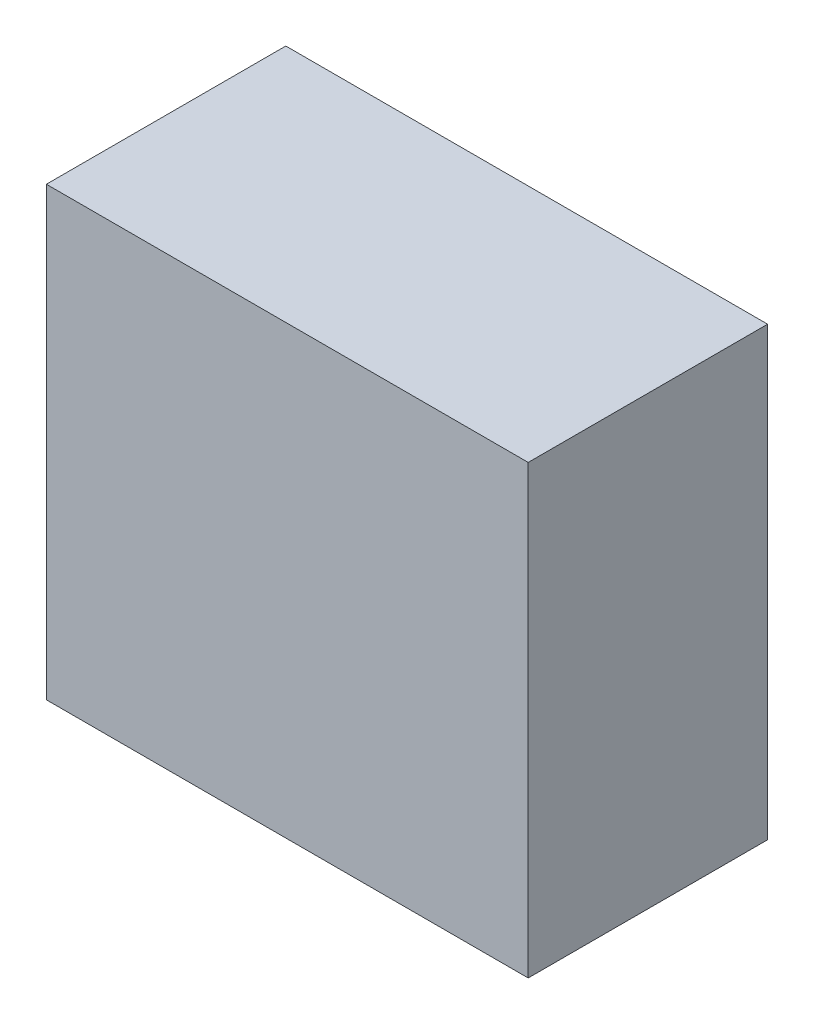
ISO-10303-21;
HEADER;
FILE_DESCRIPTION(('STEP AP214'),'2;1');
FILE_NAME('part.step','',(''),(''),'','','');
FILE_SCHEMA(('AUTOMOTIVE_DESIGN { 1 0 10303 214 1 1 1 1 }'));
ENDSEC;
DATA;
#1=APPLICATION_CONTEXT('core data for automotive mechanical design processes');
#2=APPLICATION_PROTOCOL_DEFINITION('international standard','automotive_design',2000,#1);
#3=PRODUCT_CONTEXT('',#1,'mechanical');
#4=PRODUCT('Part','Part','',(#3));
#5=PRODUCT_RELATED_PRODUCT_CATEGORY('part','',(#4));
#6=PRODUCT_DEFINITION_FORMATION('','',#4);
#7=PRODUCT_DEFINITION_CONTEXT('part definition',#1,'design');
#8=PRODUCT_DEFINITION('design','',#6,#7);
#9=PRODUCT_DEFINITION_SHAPE('','',#8);
#10=(LENGTH_UNIT() NAMED_UNIT(*) SI_UNIT(.MILLI.,.METRE.));
#11=(NAMED_UNIT(*) PLANE_ANGLE_UNIT() SI_UNIT($,.RADIAN.));
#12=(NAMED_UNIT(*) SI_UNIT($,.STERADIAN.) SOLID_ANGLE_UNIT());
#13=UNCERTAINTY_MEASURE_WITH_UNIT(LENGTH_MEASURE(1.E-05),#10,'distance_accuracy_value','');
#14=(GEOMETRIC_REPRESENTATION_CONTEXT(3) GLOBAL_UNCERTAINTY_ASSIGNED_CONTEXT((#13)) GLOBAL_UNIT_ASSIGNED_CONTEXT((#10,
#11,#12)) REPRESENTATION_CONTEXT('',''));
#15=CARTESIAN_POINT('',(0.,0.,0.));
#16=DIRECTION('',(0.,0.,1.));
#17=DIRECTION('',(1.,0.,0.));
#18=AXIS2_PLACEMENT_3D('',#15,#16,#17);
#19=CARTESIAN_POINT('',(20.125,37.3,-10.));
#20=DIRECTION('',(0.,1.,0.));
#21=DIRECTION('',(0.,0.,1.));
#22=AXIS2_PLACEMENT_3D('',#19,#20,#21);
#23=PLANE('',#22);
#24=DIRECTION('',(-1.,0.,0.));
#25=VECTOR('',#24,1.);
#26=CARTESIAN_POINT('',(20.125,37.3,10.));
#27=LINE('',#26,#25);
#28=CARTESIAN_POINT('',(20.125,37.3,10.));
#29=VERTEX_POINT('',#28);
#30=CARTESIAN_POINT('',(-20.125,37.3,10.));
#31=VERTEX_POINT('',#30);
#32=EDGE_CURVE('E103',#29,#31,#27,.T.);
#33=ORIENTED_EDGE('',*,*,#32,.F.);
#34=DIRECTION('',(0.,0.,1.));
#35=VECTOR('',#34,1.);
#36=CARTESIAN_POINT('',(20.125,37.3,-10.));
#37=LINE('',#36,#35);
#38=CARTESIAN_POINT('',(20.125,37.3,-10.));
#39=VERTEX_POINT('',#38);
#40=EDGE_CURVE('E11',#39,#29,#37,.T.);
#41=ORIENTED_EDGE('',*,*,#40,.F.);
#42=DIRECTION('',(-1.,0.,0.));
#43=VECTOR('',#42,1.);
#44=CARTESIAN_POINT('',(20.125,37.3,-10.));
#45=LINE('',#44,#43);
#46=CARTESIAN_POINT('',(-20.125,37.3,-10.));
#47=VERTEX_POINT('',#46);
#48=EDGE_CURVE('E97',#39,#47,#45,.T.);
#49=ORIENTED_EDGE('',*,*,#48,.T.);
#50=DIRECTION('',(0.,0.,1.));
#51=VECTOR('',#50,1.);
#52=CARTESIAN_POINT('',(-20.125,37.3,-10.));
#53=LINE('',#52,#51);
#54=EDGE_CURVE('E42',#47,#31,#53,.T.);
#55=ORIENTED_EDGE('',*,*,#54,.T.);
#56=EDGE_LOOP('',(#33,#41,#49,#55));
#57=FACE_BOUND('',#56,.T.);
#58=ADVANCED_FACE('F39',(#57),#23,.T.);
#59=CARTESIAN_POINT('',(20.125,0.,-10.));
#60=DIRECTION('',(1.,0.,0.));
#61=DIRECTION('',(0.,1.,0.));
#62=AXIS2_PLACEMENT_3D('',#59,#60,#61);
#63=PLANE('',#62);
#64=DIRECTION('',(0.,1.,0.));
#65=VECTOR('',#64,1.);
#66=CARTESIAN_POINT('',(20.125,0.,10.));
#67=LINE('',#66,#65);
#68=CARTESIAN_POINT('',(20.125,0.,10.));
#69=VERTEX_POINT('',#68);
#70=EDGE_CURVE('E99',#69,#29,#67,.T.);
#71=ORIENTED_EDGE('',*,*,#70,.F.);
#72=DIRECTION('',(0.,0.,1.));
#73=VECTOR('',#72,1.);
#74=CARTESIAN_POINT('',(20.125,0.,-10.));
#75=LINE('',#74,#73);
#76=CARTESIAN_POINT('',(20.125,0.,-10.));
#77=VERTEX_POINT('',#76);
#78=EDGE_CURVE('E48',#77,#69,#75,.T.);
#79=ORIENTED_EDGE('',*,*,#78,.F.);
#80=DIRECTION('',(0.,1.,0.));
#81=VECTOR('',#80,1.);
#82=CARTESIAN_POINT('',(20.125,0.,-10.));
#83=LINE('',#82,#81);
#84=EDGE_CURVE('E94',#77,#39,#83,.T.);
#85=ORIENTED_EDGE('',*,*,#84,.T.);
#86=ORIENTED_EDGE('',*,*,#40,.T.);
#87=EDGE_LOOP('',(#71,#79,#85,#86));
#88=FACE_BOUND('',#87,.T.);
#89=ADVANCED_FACE('F113',(#88),#63,.T.);
#90=CARTESIAN_POINT('',(-20.125,0.,-10.));
#91=DIRECTION('',(0.,-1.,0.));
#92=DIRECTION('',(0.,0.,-1.));
#93=AXIS2_PLACEMENT_3D('',#90,#91,#92);
#94=PLANE('',#93);
#95=DIRECTION('',(1.,0.,0.));
#96=VECTOR('',#95,1.);
#97=CARTESIAN_POINT('',(-20.125,0.,10.));
#98=LINE('',#97,#96);
#99=CARTESIAN_POINT('',(-20.125,0.,10.));
#100=VERTEX_POINT('',#99);
#101=EDGE_CURVE('E89',#100,#69,#98,.T.);
#102=ORIENTED_EDGE('',*,*,#101,.F.);
#103=DIRECTION('',(0.,0.,1.));
#104=VECTOR('',#103,1.);
#105=CARTESIAN_POINT('',(-20.125,0.,-10.));
#106=LINE('',#105,#104);
#107=CARTESIAN_POINT('',(-20.125,0.,-10.));
#108=VERTEX_POINT('',#107);
#109=EDGE_CURVE('E84',#108,#100,#106,.T.);
#110=ORIENTED_EDGE('',*,*,#109,.F.);
#111=DIRECTION('',(1.,0.,0.));
#112=VECTOR('',#111,1.);
#113=CARTESIAN_POINT('',(-20.125,0.,-10.));
#114=LINE('',#113,#112);
#115=EDGE_CURVE('E87',#108,#77,#114,.T.);
#116=ORIENTED_EDGE('',*,*,#115,.T.);
#117=ORIENTED_EDGE('',*,*,#78,.T.);
#118=EDGE_LOOP('',(#102,#110,#116,#117));
#119=FACE_BOUND('',#118,.T.);
#120=ADVANCED_FACE('F86',(#119),#94,.T.);
#121=CARTESIAN_POINT('',(-20.125,37.3,-10.));
#122=DIRECTION('',(-1.,0.,0.));
#123=DIRECTION('',(0.,0.,1.));
#124=AXIS2_PLACEMENT_3D('',#121,#122,#123);
#125=PLANE('',#124);
#126=DIRECTION('',(0.,-1.,0.));
#127=VECTOR('',#126,1.);
#128=CARTESIAN_POINT('',(-20.125,37.3,10.));
#129=LINE('',#128,#127);
#130=EDGE_CURVE('E106',#31,#100,#129,.T.);
#131=ORIENTED_EDGE('',*,*,#130,.F.);
#132=ORIENTED_EDGE('',*,*,#54,.F.);
#133=DIRECTION('',(0.,-1.,0.));
#134=VECTOR('',#133,1.);
#135=CARTESIAN_POINT('',(-20.125,37.3,-10.));
#136=LINE('',#135,#134);
#137=EDGE_CURVE('E93',#47,#108,#136,.T.);
#138=ORIENTED_EDGE('',*,*,#137,.T.);
#139=ORIENTED_EDGE('',*,*,#109,.T.);
#140=EDGE_LOOP('',(#131,#132,#138,#139));
#141=FACE_BOUND('',#140,.T.);
#142=ADVANCED_FACE('F96',(#141),#125,.T.);
#143=CARTESIAN_POINT('',(0.,0.,-10.));
#144=DIRECTION('',(0.,0.,1.));
#145=DIRECTION('',(1.,0.,0.));
#146=AXIS2_PLACEMENT_3D('',#143,#144,#145);
#147=PLANE('',#146);
#148=ORIENTED_EDGE('',*,*,#48,.F.);
#149=ORIENTED_EDGE('',*,*,#84,.F.);
#150=ORIENTED_EDGE('',*,*,#115,.F.);
#151=ORIENTED_EDGE('',*,*,#137,.F.);
#152=EDGE_LOOP('',(#148,#149,#150,#151));
#153=FACE_BOUND('',#152,.T.);
#154=ADVANCED_FACE('F92',(#153),#147,.F.);
#155=CARTESIAN_POINT('',(0.,0.,10.));
#156=DIRECTION('',(0.,0.,1.));
#157=DIRECTION('',(1.,0.,0.));
#158=AXIS2_PLACEMENT_3D('',#155,#156,#157);
#159=PLANE('',#158);
#160=ORIENTED_EDGE('',*,*,#32,.T.);
#161=ORIENTED_EDGE('',*,*,#130,.T.);
#162=ORIENTED_EDGE('',*,*,#101,.T.);
#163=ORIENTED_EDGE('',*,*,#70,.T.);
#164=EDGE_LOOP('',(#160,#161,#162,#163));
#165=FACE_BOUND('',#164,.T.);
#166=ADVANCED_FACE('F112',(#165),#159,.T.);
#167=CLOSED_SHELL('',(#58,#89,#120,#142,#154,#166));
#168=MANIFOLD_SOLID_BREP('B2',#167);
#169=ADVANCED_BREP_SHAPE_REPRESENTATION('',(#18,#168),#14);
#170=SHAPE_DEFINITION_REPRESENTATION(#9,#169);
ENDSEC;
END-ISO-10303-21;
